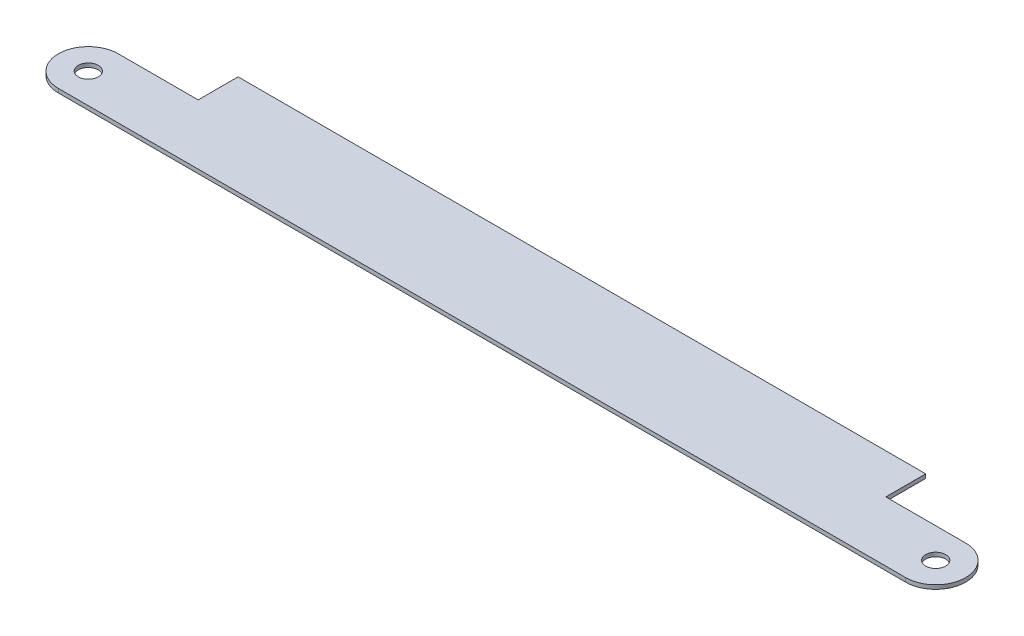
ISO-10303-21;
HEADER;
FILE_DESCRIPTION(('STEP AP214'),'2;1');
FILE_NAME('part.step','',(''),(''),'','','');
FILE_SCHEMA(('AUTOMOTIVE_DESIGN { 1 0 10303 214 1 1 1 1 }'));
ENDSEC;
DATA;
#1=APPLICATION_CONTEXT('core data for automotive mechanical design processes');
#2=APPLICATION_PROTOCOL_DEFINITION('international standard','automotive_design',2000,#1);
#3=PRODUCT_CONTEXT('',#1,'mechanical');
#4=PRODUCT('Part','Part','',(#3));
#5=PRODUCT_RELATED_PRODUCT_CATEGORY('part','',(#4));
#6=PRODUCT_DEFINITION_FORMATION('','',#4);
#7=PRODUCT_DEFINITION_CONTEXT('part definition',#1,'design');
#8=PRODUCT_DEFINITION('design','',#6,#7);
#9=PRODUCT_DEFINITION_SHAPE('','',#8);
#10=(LENGTH_UNIT() NAMED_UNIT(*) SI_UNIT(.MILLI.,.METRE.));
#11=(NAMED_UNIT(*) PLANE_ANGLE_UNIT() SI_UNIT($,.RADIAN.));
#12=(NAMED_UNIT(*) SI_UNIT($,.STERADIAN.) SOLID_ANGLE_UNIT());
#13=UNCERTAINTY_MEASURE_WITH_UNIT(LENGTH_MEASURE(1.E-05),#10,'distance_accuracy_value','');
#14=(GEOMETRIC_REPRESENTATION_CONTEXT(3) GLOBAL_UNCERTAINTY_ASSIGNED_CONTEXT((#13)) GLOBAL_UNIT_ASSIGNED_CONTEXT((#10,
#11,#12)) REPRESENTATION_CONTEXT('',''));
#15=CARTESIAN_POINT('',(0.,0.,0.));
#16=DIRECTION('',(0.,0.,1.));
#17=DIRECTION('',(1.,0.,0.));
#18=AXIS2_PLACEMENT_3D('',#15,#16,#17);
#19=CARTESIAN_POINT('',(212.13,1.,0.));
#20=DIRECTION('',(0.,1.,0.));
#21=DIRECTION('',(0.,0.,1.));
#22=AXIS2_PLACEMENT_3D('',#19,#20,#21);
#23=PLANE('',#22);
#24=CARTESIAN_POINT('',(0.,1.,0.));
#25=DIRECTION('',(0.,1.,0.));
#26=DIRECTION('',(0.,0.,1.));
#27=AXIS2_PLACEMENT_3D('',#24,#25,#26);
#28=CIRCLE('',#27,2.5);
#29=CARTESIAN_POINT('',(0.,1.,2.5));
#30=VERTEX_POINT('',#29);
#31=EDGE_CURVE('E134',#30,#30,#28,.T.);
#32=ORIENTED_EDGE('',*,*,#31,.F.);
#33=EDGE_LOOP('',(#32));
#34=FACE_BOUND('',#33,.T.);
#35=CARTESIAN_POINT('',(212.13,1.,0.));
#36=DIRECTION('',(0.,1.,0.));
#37=DIRECTION('',(0.,0.,1.));
#38=AXIS2_PLACEMENT_3D('',#35,#36,#37);
#39=CIRCLE('',#38,7.5);
#40=CARTESIAN_POINT('',(212.13,1.,7.5));
#41=VERTEX_POINT('',#40);
#42=CARTESIAN_POINT('',(212.13,1.,-7.5));
#43=VERTEX_POINT('',#42);
#44=EDGE_CURVE('E145',#41,#43,#39,.T.);
#45=ORIENTED_EDGE('',*,*,#44,.T.);
#46=DIRECTION('',(-1.,0.,0.));
#47=VECTOR('',#46,1.);
#48=CARTESIAN_POINT('',(192.13,1.,-7.50000000000002));
#49=LINE('',#48,#47);
#50=CARTESIAN_POINT('',(192.13,1.,-7.50000000000002));
#51=VERTEX_POINT('',#50);
#52=EDGE_CURVE('E93',#43,#51,#49,.T.);
#53=ORIENTED_EDGE('',*,*,#52,.T.);
#54=DIRECTION('',(0.,0.,-1.));
#55=VECTOR('',#54,1.);
#56=CARTESIAN_POINT('',(192.13,1.,-17.5));
#57=LINE('',#56,#55);
#58=CARTESIAN_POINT('',(192.13,1.,-17.5));
#59=VERTEX_POINT('',#58);
#60=EDGE_CURVE('E160',#51,#59,#57,.T.);
#61=ORIENTED_EDGE('',*,*,#60,.T.);
#62=DIRECTION('',(-1.,0.,0.));
#63=VECTOR('',#62,1.);
#64=CARTESIAN_POINT('',(20.,1.,-17.5));
#65=LINE('',#64,#63);
#66=CARTESIAN_POINT('',(20.,1.,-17.5));
#67=VERTEX_POINT('',#66);
#68=EDGE_CURVE('E173',#59,#67,#65,.T.);
#69=ORIENTED_EDGE('',*,*,#68,.T.);
#70=DIRECTION('',(0.,0.,1.));
#71=VECTOR('',#70,1.);
#72=CARTESIAN_POINT('',(20.,1.,-7.5));
#73=LINE('',#72,#71);
#74=CARTESIAN_POINT('',(20.,1.,-7.5));
#75=VERTEX_POINT('',#74);
#76=EDGE_CURVE('E112',#67,#75,#73,.T.);
#77=ORIENTED_EDGE('',*,*,#76,.T.);
#78=DIRECTION('',(-1.,0.,0.));
#79=VECTOR('',#78,1.);
#80=CARTESIAN_POINT('',(0.,1.,-7.5));
#81=LINE('',#80,#79);
#82=CARTESIAN_POINT('',(0.,1.,-7.5));
#83=VERTEX_POINT('',#82);
#84=EDGE_CURVE('E106',#75,#83,#81,.T.);
#85=ORIENTED_EDGE('',*,*,#84,.T.);
#86=CARTESIAN_POINT('',(0.,1.,0.));
#87=DIRECTION('',(0.,1.,0.));
#88=DIRECTION('',(0.,0.,1.));
#89=AXIS2_PLACEMENT_3D('',#86,#87,#88);
#90=CIRCLE('',#89,7.5);
#91=CARTESIAN_POINT('',(0.,1.,7.5));
#92=VERTEX_POINT('',#91);
#93=EDGE_CURVE('E110',#83,#92,#90,.T.);
#94=ORIENTED_EDGE('',*,*,#93,.T.);
#95=DIRECTION('',(1.,0.,0.));
#96=VECTOR('',#95,1.);
#97=CARTESIAN_POINT('',(0.,1.,7.5));
#98=LINE('',#97,#96);
#99=EDGE_CURVE('E50',#92,#41,#98,.T.);
#100=ORIENTED_EDGE('',*,*,#99,.T.);
#101=EDGE_LOOP('',(#45,#53,#61,#69,#77,#85,#94,#100));
#102=FACE_BOUND('',#101,.T.);
#103=CARTESIAN_POINT('',(212.13,1.,0.));
#104=DIRECTION('',(0.,1.,0.));
#105=DIRECTION('',(0.,0.,1.));
#106=AXIS2_PLACEMENT_3D('',#103,#104,#105);
#107=CIRCLE('',#106,2.5);
#108=CARTESIAN_POINT('',(212.13,1.,2.49999999999996));
#109=VERTEX_POINT('',#108);
#110=EDGE_CURVE('E182',#109,#109,#107,.T.);
#111=ORIENTED_EDGE('',*,*,#110,.F.);
#112=EDGE_LOOP('',(#111));
#113=FACE_BOUND('',#112,.T.);
#114=ADVANCED_FACE('F33',(#34,#102,#113),#23,.T.);
#115=CARTESIAN_POINT('',(212.13,0.,0.));
#116=DIRECTION('',(0.,1.,0.));
#117=DIRECTION('',(0.,0.,1.));
#118=AXIS2_PLACEMENT_3D('',#115,#116,#117);
#119=PLANE('',#118);
#120=CARTESIAN_POINT('',(212.13,0.,0.));
#121=DIRECTION('',(0.,1.,0.));
#122=DIRECTION('',(0.,0.,1.));
#123=AXIS2_PLACEMENT_3D('',#120,#121,#122);
#124=CIRCLE('',#123,7.5);
#125=CARTESIAN_POINT('',(212.13,0.,7.5));
#126=VERTEX_POINT('',#125);
#127=CARTESIAN_POINT('',(212.13,0.,-7.5));
#128=VERTEX_POINT('',#127);
#129=EDGE_CURVE('E130',#126,#128,#124,.T.);
#130=ORIENTED_EDGE('',*,*,#129,.F.);
#131=DIRECTION('',(1.,0.,0.));
#132=VECTOR('',#131,1.);
#133=CARTESIAN_POINT('',(0.,0.,7.5));
#134=LINE('',#133,#132);
#135=CARTESIAN_POINT('',(0.,0.,7.5));
#136=VERTEX_POINT('',#135);
#137=EDGE_CURVE('E85',#136,#126,#134,.T.);
#138=ORIENTED_EDGE('',*,*,#137,.F.);
#139=CARTESIAN_POINT('',(0.,0.,0.));
#140=DIRECTION('',(0.,1.,0.));
#141=DIRECTION('',(0.,0.,1.));
#142=AXIS2_PLACEMENT_3D('',#139,#140,#141);
#143=CIRCLE('',#142,7.5);
#144=CARTESIAN_POINT('',(0.,0.,-7.5));
#145=VERTEX_POINT('',#144);
#146=EDGE_CURVE('E79',#145,#136,#143,.T.);
#147=ORIENTED_EDGE('',*,*,#146,.F.);
#148=DIRECTION('',(-1.,0.,0.));
#149=VECTOR('',#148,1.);
#150=CARTESIAN_POINT('',(0.,0.,-7.5));
#151=LINE('',#150,#149);
#152=CARTESIAN_POINT('',(20.,0.,-7.5));
#153=VERTEX_POINT('',#152);
#154=EDGE_CURVE('E120',#153,#145,#151,.T.);
#155=ORIENTED_EDGE('',*,*,#154,.F.);
#156=DIRECTION('',(0.,0.,1.));
#157=VECTOR('',#156,1.);
#158=CARTESIAN_POINT('',(20.,0.,-7.5));
#159=LINE('',#158,#157);
#160=CARTESIAN_POINT('',(20.,0.,-17.5));
#161=VERTEX_POINT('',#160);
#162=EDGE_CURVE('E140',#161,#153,#159,.T.);
#163=ORIENTED_EDGE('',*,*,#162,.F.);
#164=DIRECTION('',(-1.,0.,0.));
#165=VECTOR('',#164,1.);
#166=CARTESIAN_POINT('',(20.,0.,-17.5));
#167=LINE('',#166,#165);
#168=CARTESIAN_POINT('',(192.13,0.,-17.5));
#169=VERTEX_POINT('',#168);
#170=EDGE_CURVE('E138',#169,#161,#167,.T.);
#171=ORIENTED_EDGE('',*,*,#170,.F.);
#172=DIRECTION('',(0.,0.,-1.));
#173=VECTOR('',#172,1.);
#174=CARTESIAN_POINT('',(192.13,0.,-17.5));
#175=LINE('',#174,#173);
#176=CARTESIAN_POINT('',(192.13,0.,-7.50000000000002));
#177=VERTEX_POINT('',#176);
#178=EDGE_CURVE('E136',#177,#169,#175,.T.);
#179=ORIENTED_EDGE('',*,*,#178,.F.);
#180=DIRECTION('',(-1.,0.,0.));
#181=VECTOR('',#180,1.);
#182=CARTESIAN_POINT('',(192.13,0.,-7.50000000000002));
#183=LINE('',#182,#181);
#184=EDGE_CURVE('E133',#128,#177,#183,.T.);
#185=ORIENTED_EDGE('',*,*,#184,.F.);
#186=EDGE_LOOP('',(#130,#138,#147,#155,#163,#171,#179,#185));
#187=FACE_BOUND('',#186,.T.);
#188=CARTESIAN_POINT('',(0.,0.,0.));
#189=DIRECTION('',(0.,1.,0.));
#190=DIRECTION('',(0.,0.,1.));
#191=AXIS2_PLACEMENT_3D('',#188,#189,#190);
#192=CIRCLE('',#191,2.5);
#193=CARTESIAN_POINT('',(0.,0.,2.5));
#194=VERTEX_POINT('',#193);
#195=EDGE_CURVE('E179',#194,#194,#192,.T.);
#196=ORIENTED_EDGE('',*,*,#195,.T.);
#197=EDGE_LOOP('',(#196));
#198=FACE_BOUND('',#197,.T.);
#199=CARTESIAN_POINT('',(212.13,0.,0.));
#200=DIRECTION('',(0.,1.,0.));
#201=DIRECTION('',(0.,0.,1.));
#202=AXIS2_PLACEMENT_3D('',#199,#200,#201);
#203=CIRCLE('',#202,2.5);
#204=CARTESIAN_POINT('',(212.13,0.,2.49999999999996));
#205=VERTEX_POINT('',#204);
#206=EDGE_CURVE('E185',#205,#205,#203,.T.);
#207=ORIENTED_EDGE('',*,*,#206,.T.);
#208=EDGE_LOOP('',(#207));
#209=FACE_BOUND('',#208,.T.);
#210=ADVANCED_FACE('F164',(#187,#198,#209),#119,.F.);
#211=CARTESIAN_POINT('',(212.13,1.,0.));
#212=DIRECTION('',(0.,-1.,0.));
#213=DIRECTION('',(0.,0.,-1.));
#214=AXIS2_PLACEMENT_3D('',#211,#212,#213);
#215=CYLINDRICAL_SURFACE('',#214,7.5);
#216=ORIENTED_EDGE('',*,*,#129,.T.);
#217=DIRECTION('',(0.,-1.,0.));
#218=VECTOR('',#217,1.);
#219=CARTESIAN_POINT('',(212.13,1.,-7.5));
#220=LINE('',#219,#218);
#221=EDGE_CURVE('E11',#43,#128,#220,.T.);
#222=ORIENTED_EDGE('',*,*,#221,.F.);
#223=ORIENTED_EDGE('',*,*,#44,.F.);
#224=DIRECTION('',(0.,-1.,0.));
#225=VECTOR('',#224,1.);
#226=CARTESIAN_POINT('',(212.13,1.,7.5));
#227=LINE('',#226,#225);
#228=EDGE_CURVE('E126',#41,#126,#227,.T.);
#229=ORIENTED_EDGE('',*,*,#228,.T.);
#230=EDGE_LOOP('',(#216,#222,#223,#229));
#231=FACE_BOUND('',#230,.T.);
#232=ADVANCED_FACE('F35',(#231),#215,.T.);
#233=CARTESIAN_POINT('',(192.13,1.,-7.50000000000002));
#234=DIRECTION('',(0.,0.,1.));
#235=DIRECTION('',(1.,0.,0.));
#236=AXIS2_PLACEMENT_3D('',#233,#234,#235);
#237=PLANE('',#236);
#238=ORIENTED_EDGE('',*,*,#184,.T.);
#239=DIRECTION('',(0.,-1.,0.));
#240=VECTOR('',#239,1.);
#241=CARTESIAN_POINT('',(192.13,1.,-7.50000000000002));
#242=LINE('',#241,#240);
#243=EDGE_CURVE('E42',#51,#177,#242,.T.);
#244=ORIENTED_EDGE('',*,*,#243,.F.);
#245=ORIENTED_EDGE('',*,*,#52,.F.);
#246=ORIENTED_EDGE('',*,*,#221,.T.);
#247=EDGE_LOOP('',(#238,#244,#245,#246));
#248=FACE_BOUND('',#247,.T.);
#249=ADVANCED_FACE('F217',(#248),#237,.F.);
#250=CARTESIAN_POINT('',(192.13,1.,-17.5));
#251=DIRECTION('',(-1.,0.,0.));
#252=DIRECTION('',(0.,0.,1.));
#253=AXIS2_PLACEMENT_3D('',#250,#251,#252);
#254=PLANE('',#253);
#255=ORIENTED_EDGE('',*,*,#178,.T.);
#256=DIRECTION('',(0.,-1.,0.));
#257=VECTOR('',#256,1.);
#258=CARTESIAN_POINT('',(192.13,1.,-17.5));
#259=LINE('',#258,#257);
#260=EDGE_CURVE('E152',#59,#169,#259,.T.);
#261=ORIENTED_EDGE('',*,*,#260,.F.);
#262=ORIENTED_EDGE('',*,*,#60,.F.);
#263=ORIENTED_EDGE('',*,*,#243,.T.);
#264=EDGE_LOOP('',(#255,#261,#262,#263));
#265=FACE_BOUND('',#264,.T.);
#266=ADVANCED_FACE('F158',(#265),#254,.F.);
#267=CARTESIAN_POINT('',(20.,1.,-17.5));
#268=DIRECTION('',(0.,0.,1.));
#269=DIRECTION('',(1.,0.,0.));
#270=AXIS2_PLACEMENT_3D('',#267,#268,#269);
#271=PLANE('',#270);
#272=ORIENTED_EDGE('',*,*,#170,.T.);
#273=DIRECTION('',(0.,-1.,0.));
#274=VECTOR('',#273,1.);
#275=CARTESIAN_POINT('',(20.,1.,-17.5));
#276=LINE('',#275,#274);
#277=EDGE_CURVE('E149',#67,#161,#276,.T.);
#278=ORIENTED_EDGE('',*,*,#277,.F.);
#279=ORIENTED_EDGE('',*,*,#68,.F.);
#280=ORIENTED_EDGE('',*,*,#260,.T.);
#281=EDGE_LOOP('',(#272,#278,#279,#280));
#282=FACE_BOUND('',#281,.T.);
#283=ADVANCED_FACE('F169',(#282),#271,.F.);
#284=CARTESIAN_POINT('',(20.,1.,-7.5));
#285=DIRECTION('',(1.,0.,0.));
#286=DIRECTION('',(0.,0.,-1.));
#287=AXIS2_PLACEMENT_3D('',#284,#285,#286);
#288=PLANE('',#287);
#289=ORIENTED_EDGE('',*,*,#162,.T.);
#290=DIRECTION('',(0.,-1.,0.));
#291=VECTOR('',#290,1.);
#292=CARTESIAN_POINT('',(20.,1.,-7.5));
#293=LINE('',#292,#291);
#294=EDGE_CURVE('E121',#75,#153,#293,.T.);
#295=ORIENTED_EDGE('',*,*,#294,.F.);
#296=ORIENTED_EDGE('',*,*,#76,.F.);
#297=ORIENTED_EDGE('',*,*,#277,.T.);
#298=EDGE_LOOP('',(#289,#295,#296,#297));
#299=FACE_BOUND('',#298,.T.);
#300=ADVANCED_FACE('F172',(#299),#288,.F.);
#301=CARTESIAN_POINT('',(0.,1.,-7.5));
#302=DIRECTION('',(0.,0.,1.));
#303=DIRECTION('',(1.,0.,0.));
#304=AXIS2_PLACEMENT_3D('',#301,#302,#303);
#305=PLANE('',#304);
#306=ORIENTED_EDGE('',*,*,#154,.T.);
#307=DIRECTION('',(0.,-1.,0.));
#308=VECTOR('',#307,1.);
#309=CARTESIAN_POINT('',(0.,1.,-7.5));
#310=LINE('',#309,#308);
#311=EDGE_CURVE('E117',#83,#145,#310,.T.);
#312=ORIENTED_EDGE('',*,*,#311,.F.);
#313=ORIENTED_EDGE('',*,*,#84,.F.);
#314=ORIENTED_EDGE('',*,*,#294,.T.);
#315=EDGE_LOOP('',(#306,#312,#313,#314));
#316=FACE_BOUND('',#315,.T.);
#317=ADVANCED_FACE('F118',(#316),#305,.F.);
#318=CARTESIAN_POINT('',(0.,1.,0.));
#319=DIRECTION('',(0.,-1.,0.));
#320=DIRECTION('',(0.,0.,-1.));
#321=AXIS2_PLACEMENT_3D('',#318,#319,#320);
#322=CYLINDRICAL_SURFACE('',#321,7.5);
#323=ORIENTED_EDGE('',*,*,#146,.T.);
#324=DIRECTION('',(0.,-1.,0.));
#325=VECTOR('',#324,1.);
#326=CARTESIAN_POINT('',(0.,1.,7.5));
#327=LINE('',#326,#325);
#328=EDGE_CURVE('E122',#92,#136,#327,.T.);
#329=ORIENTED_EDGE('',*,*,#328,.F.);
#330=ORIENTED_EDGE('',*,*,#93,.F.);
#331=ORIENTED_EDGE('',*,*,#311,.T.);
#332=EDGE_LOOP('',(#323,#329,#330,#331));
#333=FACE_BOUND('',#332,.T.);
#334=ADVANCED_FACE('F124',(#333),#322,.T.);
#335=CARTESIAN_POINT('',(0.,1.,7.5));
#336=DIRECTION('',(0.,0.,-1.));
#337=DIRECTION('',(-1.,0.,0.));
#338=AXIS2_PLACEMENT_3D('',#335,#336,#337);
#339=PLANE('',#338);
#340=ORIENTED_EDGE('',*,*,#137,.T.);
#341=ORIENTED_EDGE('',*,*,#228,.F.);
#342=ORIENTED_EDGE('',*,*,#99,.F.);
#343=ORIENTED_EDGE('',*,*,#328,.T.);
#344=EDGE_LOOP('',(#340,#341,#342,#343));
#345=FACE_BOUND('',#344,.T.);
#346=ADVANCED_FACE('F205',(#345),#339,.F.);
#347=CARTESIAN_POINT('',(0.,1.,0.));
#348=DIRECTION('',(0.,-1.,0.));
#349=DIRECTION('',(0.,0.,-1.));
#350=AXIS2_PLACEMENT_3D('',#347,#348,#349);
#351=CYLINDRICAL_SURFACE('',#350,2.5);
#352=ORIENTED_EDGE('',*,*,#31,.T.);
#353=EDGE_LOOP('',(#352));
#354=FACE_BOUND('',#353,.T.);
#355=ORIENTED_EDGE('',*,*,#195,.F.);
#356=EDGE_LOOP('',(#355));
#357=FACE_BOUND('',#356,.T.);
#358=ADVANCED_FACE('F202',(#354,#357),#351,.F.);
#359=CARTESIAN_POINT('',(212.13,1.,0.));
#360=DIRECTION('',(0.,-1.,0.));
#361=DIRECTION('',(0.,0.,-1.));
#362=AXIS2_PLACEMENT_3D('',#359,#360,#361);
#363=CYLINDRICAL_SURFACE('',#362,2.5);
#364=ORIENTED_EDGE('',*,*,#110,.T.);
#365=EDGE_LOOP('',(#364));
#366=FACE_BOUND('',#365,.T.);
#367=ORIENTED_EDGE('',*,*,#206,.F.);
#368=EDGE_LOOP('',(#367));
#369=FACE_BOUND('',#368,.T.);
#370=ADVANCED_FACE('F191',(#366,#369),#363,.F.);
#371=CLOSED_SHELL('',(#114,#210,#232,#249,#266,#283,#300,#317,#334,#346,#358,#370));
#372=MANIFOLD_SOLID_BREP('B2',#371);
#373=ADVANCED_BREP_SHAPE_REPRESENTATION('',(#18,#372),#14);
#374=SHAPE_DEFINITION_REPRESENTATION(#9,#373);
ENDSEC;
END-ISO-10303-21;
